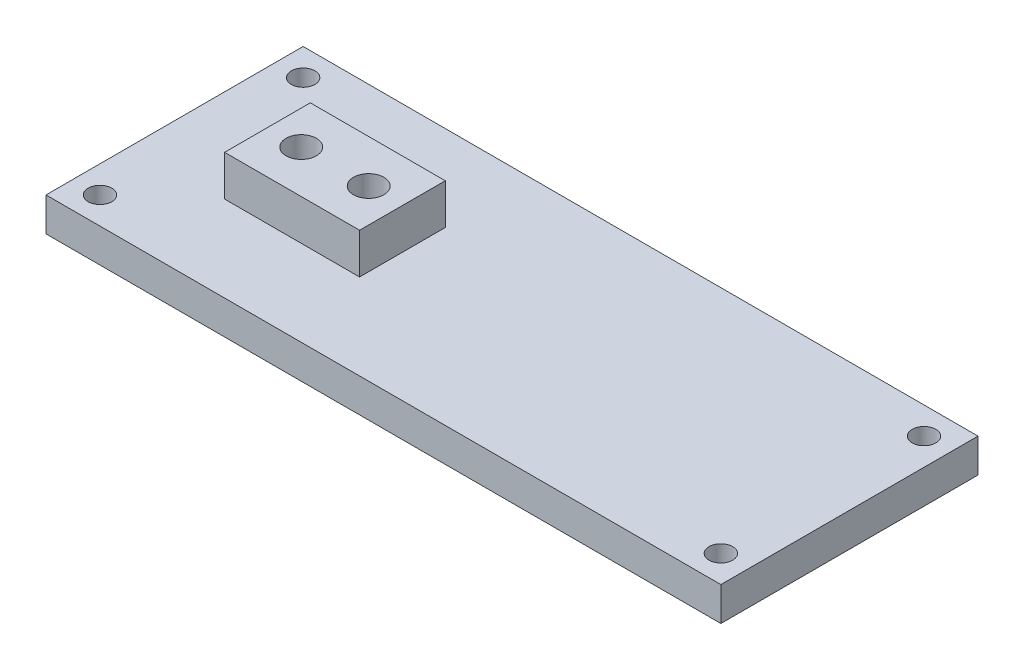
ISO-10303-21;
HEADER;
FILE_DESCRIPTION(('STEP AP214'),'2;1');
FILE_NAME('part.step','',(''),(''),'','','');
FILE_SCHEMA(('AUTOMOTIVE_DESIGN { 1 0 10303 214 1 1 1 1 }'));
ENDSEC;
DATA;
#1=APPLICATION_CONTEXT('core data for automotive mechanical design processes');
#2=APPLICATION_PROTOCOL_DEFINITION('international standard','automotive_design',2000,#1);
#3=PRODUCT_CONTEXT('',#1,'mechanical');
#4=PRODUCT('Part','Part','',(#3));
#5=PRODUCT_RELATED_PRODUCT_CATEGORY('part','',(#4));
#6=PRODUCT_DEFINITION_FORMATION('','',#4);
#7=PRODUCT_DEFINITION_CONTEXT('part definition',#1,'design');
#8=PRODUCT_DEFINITION('design','',#6,#7);
#9=PRODUCT_DEFINITION_SHAPE('','',#8);
#10=(LENGTH_UNIT() NAMED_UNIT(*) SI_UNIT(.MILLI.,.METRE.));
#11=(NAMED_UNIT(*) PLANE_ANGLE_UNIT() SI_UNIT($,.RADIAN.));
#12=(NAMED_UNIT(*) SI_UNIT($,.STERADIAN.) SOLID_ANGLE_UNIT());
#13=UNCERTAINTY_MEASURE_WITH_UNIT(LENGTH_MEASURE(1.E-05),#10,'distance_accuracy_value','');
#14=(GEOMETRIC_REPRESENTATION_CONTEXT(3) GLOBAL_UNCERTAINTY_ASSIGNED_CONTEXT((#13)) GLOBAL_UNIT_ASSIGNED_CONTEXT((#10,
#11,#12)) REPRESENTATION_CONTEXT('',''));
#15=CARTESIAN_POINT('',(0.,0.,0.));
#16=DIRECTION('',(0.,0.,1.));
#17=DIRECTION('',(1.,0.,0.));
#18=AXIS2_PLACEMENT_3D('',#15,#16,#17);
#19=CARTESIAN_POINT('',(-31.2366457438927,0.,0.));
#20=DIRECTION('',(0.,1.,0.));
#21=DIRECTION('',(0.,0.,1.));
#22=AXIS2_PLACEMENT_3D('',#19,#20,#21);
#23=CYLINDRICAL_SURFACE('',#22,2.25);
#24=CARTESIAN_POINT('',(-31.2366457438927,11.,0.));
#25=DIRECTION('',(0.,1.,0.));
#26=DIRECTION('',(0.,0.,1.));
#27=AXIS2_PLACEMENT_3D('',#24,#25,#26);
#28=CIRCLE('',#27,2.25);
#29=CARTESIAN_POINT('',(-31.2366457438927,11.,2.25));
#30=VERTEX_POINT('',#29);
#31=EDGE_CURVE('E195',#30,#30,#28,.T.);
#32=ORIENTED_EDGE('',*,*,#31,.T.);
#33=EDGE_LOOP('',(#32));
#34=FACE_BOUND('',#33,.T.);
#35=CARTESIAN_POINT('',(-31.2366457438927,3.,0.));
#36=DIRECTION('',(0.,-1.,0.));
#37=DIRECTION('',(0.,0.,-1.));
#38=AXIS2_PLACEMENT_3D('',#35,#36,#37);
#39=CIRCLE('',#38,2.25);
#40=CARTESIAN_POINT('',(-31.2366457438927,3.,-2.25));
#41=VERTEX_POINT('',#40);
#42=EDGE_CURVE('E190',#41,#41,#39,.F.);
#43=ORIENTED_EDGE('',*,*,#42,.F.);
#44=EDGE_LOOP('',(#43));
#45=FACE_BOUND('',#44,.T.);
#46=ADVANCED_FACE('F45',(#34,#45),#23,.F.);
#47=CARTESIAN_POINT('',(-21.2366457438927,0.,0.));
#48=DIRECTION('',(0.,1.,0.));
#49=DIRECTION('',(0.,0.,1.));
#50=AXIS2_PLACEMENT_3D('',#47,#48,#49);
#51=CYLINDRICAL_SURFACE('',#50,2.25);
#52=CARTESIAN_POINT('',(-21.2366457438927,11.,0.));
#53=DIRECTION('',(0.,1.,0.));
#54=DIRECTION('',(0.,0.,1.));
#55=AXIS2_PLACEMENT_3D('',#52,#53,#54);
#56=CIRCLE('',#55,2.25);
#57=CARTESIAN_POINT('',(-21.2366457438927,11.,2.25));
#58=VERTEX_POINT('',#57);
#59=EDGE_CURVE('E226',#58,#58,#56,.T.);
#60=ORIENTED_EDGE('',*,*,#59,.T.);
#61=EDGE_LOOP('',(#60));
#62=FACE_BOUND('',#61,.T.);
#63=CARTESIAN_POINT('',(-21.2366457438927,3.,0.));
#64=DIRECTION('',(0.,-1.,0.));
#65=DIRECTION('',(0.,0.,-1.));
#66=AXIS2_PLACEMENT_3D('',#63,#64,#65);
#67=CIRCLE('',#66,2.25);
#68=CARTESIAN_POINT('',(-21.2366457438927,3.,-2.25));
#69=VERTEX_POINT('',#68);
#70=EDGE_CURVE('E186',#69,#69,#67,.F.);
#71=ORIENTED_EDGE('',*,*,#70,.F.);
#72=EDGE_LOOP('',(#71));
#73=FACE_BOUND('',#72,.T.);
#74=ADVANCED_FACE('F280',(#62,#73),#51,.F.);
#75=CARTESIAN_POINT('',(0.,5.,0.));
#76=DIRECTION('',(0.,1.,0.));
#77=DIRECTION('',(0.,0.,1.));
#78=AXIS2_PLACEMENT_3D('',#75,#76,#77);
#79=PLANE('',#78);
#80=CARTESIAN_POINT('',(46.,5.,-15.05));
#81=DIRECTION('',(0.,1.,0.));
#82=DIRECTION('',(0.,0.,-1.));
#83=AXIS2_PLACEMENT_3D('',#80,#81,#82);
#84=CIRCLE('',#83,1.75);
#85=CARTESIAN_POINT('',(46.,5.,-16.8));
#86=VERTEX_POINT('',#85);
#87=EDGE_CURVE('E262',#86,#86,#84,.T.);
#88=ORIENTED_EDGE('',*,*,#87,.F.);
#89=EDGE_LOOP('',(#88));
#90=FACE_BOUND('',#89,.T.);
#91=CARTESIAN_POINT('',(46.,5.,15.05));
#92=DIRECTION('',(0.,1.,0.));
#93=DIRECTION('',(0.,0.,-1.));
#94=AXIS2_PLACEMENT_3D('',#91,#92,#93);
#95=CIRCLE('',#94,1.75);
#96=CARTESIAN_POINT('',(46.,5.,13.3));
#97=VERTEX_POINT('',#96);
#98=EDGE_CURVE('E266',#97,#97,#95,.T.);
#99=ORIENTED_EDGE('',*,*,#98,.F.);
#100=EDGE_LOOP('',(#99));
#101=FACE_BOUND('',#100,.T.);
#102=CARTESIAN_POINT('',(-46.,5.,15.05));
#103=DIRECTION('',(0.,1.,0.));
#104=DIRECTION('',(0.,0.,1.));
#105=AXIS2_PLACEMENT_3D('',#102,#103,#104);
#106=CIRCLE('',#105,1.75);
#107=CARTESIAN_POINT('',(-46.,5.,16.8));
#108=VERTEX_POINT('',#107);
#109=EDGE_CURVE('E261',#108,#108,#106,.T.);
#110=ORIENTED_EDGE('',*,*,#109,.F.);
#111=EDGE_LOOP('',(#110));
#112=FACE_BOUND('',#111,.T.);
#113=CARTESIAN_POINT('',(-46.,5.,-15.05));
#114=DIRECTION('',(0.,1.,0.));
#115=DIRECTION('',(0.,0.,1.));
#116=AXIS2_PLACEMENT_3D('',#113,#114,#115);
#117=CIRCLE('',#116,1.75);
#118=CARTESIAN_POINT('',(-46.,5.,-13.3));
#119=VERTEX_POINT('',#118);
#120=EDGE_CURVE('E201',#119,#119,#117,.T.);
#121=ORIENTED_EDGE('',*,*,#120,.F.);
#122=EDGE_LOOP('',(#121));
#123=FACE_BOUND('',#122,.T.);
#124=DIRECTION('',(0.,0.,-1.));
#125=VECTOR('',#124,1.);
#126=CARTESIAN_POINT('',(50.,5.,-19.05));
#127=LINE('',#126,#125);
#128=CARTESIAN_POINT('',(50.,5.,19.05));
#129=VERTEX_POINT('',#128);
#130=CARTESIAN_POINT('',(50.,5.,-19.05));
#131=VERTEX_POINT('',#130);
#132=EDGE_CURVE('E160',#129,#131,#127,.T.);
#133=ORIENTED_EDGE('',*,*,#132,.T.);
#134=DIRECTION('',(-1.,0.,0.));
#135=VECTOR('',#134,1.);
#136=CARTESIAN_POINT('',(-50.,5.,-19.05));
#137=LINE('',#136,#135);
#138=CARTESIAN_POINT('',(-50.,5.,-19.05));
#139=VERTEX_POINT('',#138);
#140=EDGE_CURVE('E100',#131,#139,#137,.T.);
#141=ORIENTED_EDGE('',*,*,#140,.T.);
#142=DIRECTION('',(0.,0.,1.));
#143=VECTOR('',#142,1.);
#144=CARTESIAN_POINT('',(-50.,5.,-19.05));
#145=LINE('',#144,#143);
#146=CARTESIAN_POINT('',(-50.,5.,19.05));
#147=VERTEX_POINT('',#146);
#148=EDGE_CURVE('E165',#139,#147,#145,.T.);
#149=ORIENTED_EDGE('',*,*,#148,.T.);
#150=DIRECTION('',(1.,0.,0.));
#151=VECTOR('',#150,1.);
#152=CARTESIAN_POINT('',(-50.,5.,19.05));
#153=LINE('',#152,#151);
#154=EDGE_CURVE('E72',#147,#129,#153,.T.);
#155=ORIENTED_EDGE('',*,*,#154,.T.);
#156=EDGE_LOOP('',(#133,#141,#149,#155));
#157=FACE_BOUND('',#156,.T.);
#158=DIRECTION('',(-1.,0.,0.));
#159=VECTOR('',#158,1.);
#160=CARTESIAN_POINT('',(-36.2366457438927,5.,-6.34999999999999));
#161=LINE('',#160,#159);
#162=CARTESIAN_POINT('',(-16.2366457438927,5.,-6.35));
#163=VERTEX_POINT('',#162);
#164=CARTESIAN_POINT('',(-36.2366457438927,5.,-6.34999999999999));
#165=VERTEX_POINT('',#164);
#166=EDGE_CURVE('E240',#163,#165,#161,.T.);
#167=ORIENTED_EDGE('',*,*,#166,.F.);
#168=DIRECTION('',(0.,0.,-1.));
#169=VECTOR('',#168,1.);
#170=CARTESIAN_POINT('',(-16.2366457438927,5.,-6.35));
#171=LINE('',#170,#169);
#172=CARTESIAN_POINT('',(-16.2366457438927,5.,6.35));
#173=VERTEX_POINT('',#172);
#174=EDGE_CURVE('E147',#173,#163,#171,.T.);
#175=ORIENTED_EDGE('',*,*,#174,.F.);
#176=DIRECTION('',(1.,0.,0.));
#177=VECTOR('',#176,1.);
#178=CARTESIAN_POINT('',(-36.2366457438927,5.,6.35));
#179=LINE('',#178,#177);
#180=CARTESIAN_POINT('',(-36.2366457438927,5.,6.35));
#181=VERTEX_POINT('',#180);
#182=EDGE_CURVE('E143',#181,#173,#179,.T.);
#183=ORIENTED_EDGE('',*,*,#182,.F.);
#184=DIRECTION('',(0.,0.,1.));
#185=VECTOR('',#184,1.);
#186=CARTESIAN_POINT('',(-36.2366457438927,5.,-6.34999999999999));
#187=LINE('',#186,#185);
#188=EDGE_CURVE('E243',#165,#181,#187,.T.);
#189=ORIENTED_EDGE('',*,*,#188,.F.);
#190=EDGE_LOOP('',(#167,#175,#183,#189));
#191=FACE_BOUND('',#190,.T.);
#192=ADVANCED_FACE('F277',(#90,#101,#112,#123,#157,#191),#79,.T.);
#193=CARTESIAN_POINT('',(50.,5.,-19.05));
#194=DIRECTION('',(-1.,0.,0.));
#195=DIRECTION('',(0.,0.,1.));
#196=AXIS2_PLACEMENT_3D('',#193,#194,#195);
#197=PLANE('',#196);
#198=DIRECTION('',(0.,0.,-1.));
#199=VECTOR('',#198,1.);
#200=CARTESIAN_POINT('',(50.,0.,-19.05));
#201=LINE('',#200,#199);
#202=CARTESIAN_POINT('',(50.,0.,19.05));
#203=VERTEX_POINT('',#202);
#204=CARTESIAN_POINT('',(50.,0.,-19.05));
#205=VERTEX_POINT('',#204);
#206=EDGE_CURVE('E150',#203,#205,#201,.T.);
#207=ORIENTED_EDGE('',*,*,#206,.T.);
#208=DIRECTION('',(0.,-1.,0.));
#209=VECTOR('',#208,1.);
#210=CARTESIAN_POINT('',(50.,5.,-19.05));
#211=LINE('',#210,#209);
#212=EDGE_CURVE('E11',#131,#205,#211,.T.);
#213=ORIENTED_EDGE('',*,*,#212,.F.);
#214=ORIENTED_EDGE('',*,*,#132,.F.);
#215=DIRECTION('',(0.,-1.,0.));
#216=VECTOR('',#215,1.);
#217=CARTESIAN_POINT('',(50.,5.,19.05));
#218=LINE('',#217,#216);
#219=EDGE_CURVE('E169',#129,#203,#218,.T.);
#220=ORIENTED_EDGE('',*,*,#219,.T.);
#221=EDGE_LOOP('',(#207,#213,#214,#220));
#222=FACE_BOUND('',#221,.T.);
#223=ADVANCED_FACE('F47',(#222),#197,.F.);
#224=CARTESIAN_POINT('',(-50.,5.,-19.05));
#225=DIRECTION('',(0.,0.,1.));
#226=DIRECTION('',(1.,0.,0.));
#227=AXIS2_PLACEMENT_3D('',#224,#225,#226);
#228=PLANE('',#227);
#229=DIRECTION('',(-1.,0.,0.));
#230=VECTOR('',#229,1.);
#231=CARTESIAN_POINT('',(-50.,0.,-19.05));
#232=LINE('',#231,#230);
#233=CARTESIAN_POINT('',(-50.,0.,-19.05));
#234=VERTEX_POINT('',#233);
#235=EDGE_CURVE('E155',#205,#234,#232,.T.);
#236=ORIENTED_EDGE('',*,*,#235,.T.);
#237=DIRECTION('',(0.,-1.,0.));
#238=VECTOR('',#237,1.);
#239=CARTESIAN_POINT('',(-50.,5.,-19.05));
#240=LINE('',#239,#238);
#241=EDGE_CURVE('E55',#139,#234,#240,.T.);
#242=ORIENTED_EDGE('',*,*,#241,.F.);
#243=ORIENTED_EDGE('',*,*,#140,.F.);
#244=ORIENTED_EDGE('',*,*,#212,.T.);
#245=EDGE_LOOP('',(#236,#242,#243,#244));
#246=FACE_BOUND('',#245,.T.);
#247=ADVANCED_FACE('F449',(#246),#228,.F.);
#248=CARTESIAN_POINT('',(-50.,5.,-19.05));
#249=DIRECTION('',(1.,0.,0.));
#250=DIRECTION('',(0.,0.,-1.));
#251=AXIS2_PLACEMENT_3D('',#248,#249,#250);
#252=PLANE('',#251);
#253=DIRECTION('',(0.,0.,1.));
#254=VECTOR('',#253,1.);
#255=CARTESIAN_POINT('',(-50.,0.,-19.05));
#256=LINE('',#255,#254);
#257=CARTESIAN_POINT('',(-50.,0.,19.05));
#258=VERTEX_POINT('',#257);
#259=EDGE_CURVE('E173',#234,#258,#256,.T.);
#260=ORIENTED_EDGE('',*,*,#259,.T.);
#261=DIRECTION('',(0.,-1.,0.));
#262=VECTOR('',#261,1.);
#263=CARTESIAN_POINT('',(-50.,5.,19.05));
#264=LINE('',#263,#262);
#265=EDGE_CURVE('E180',#147,#258,#264,.T.);
#266=ORIENTED_EDGE('',*,*,#265,.F.);
#267=ORIENTED_EDGE('',*,*,#148,.F.);
#268=ORIENTED_EDGE('',*,*,#241,.T.);
#269=EDGE_LOOP('',(#260,#266,#267,#268));
#270=FACE_BOUND('',#269,.T.);
#271=ADVANCED_FACE('F441',(#270),#252,.F.);
#272=CARTESIAN_POINT('',(-50.,5.,19.05));
#273=DIRECTION('',(0.,0.,-1.));
#274=DIRECTION('',(-1.,0.,0.));
#275=AXIS2_PLACEMENT_3D('',#272,#273,#274);
#276=PLANE('',#275);
#277=DIRECTION('',(1.,0.,0.));
#278=VECTOR('',#277,1.);
#279=CARTESIAN_POINT('',(-50.,0.,19.05));
#280=LINE('',#279,#278);
#281=EDGE_CURVE('E93',#258,#203,#280,.T.);
#282=ORIENTED_EDGE('',*,*,#281,.T.);
#283=ORIENTED_EDGE('',*,*,#219,.F.);
#284=ORIENTED_EDGE('',*,*,#154,.F.);
#285=ORIENTED_EDGE('',*,*,#265,.T.);
#286=EDGE_LOOP('',(#282,#283,#284,#285));
#287=FACE_BOUND('',#286,.T.);
#288=ADVANCED_FACE('F433',(#287),#276,.F.);
#289=CARTESIAN_POINT('',(0.,0.,0.));
#290=DIRECTION('',(0.,1.,0.));
#291=DIRECTION('',(0.,0.,1.));
#292=AXIS2_PLACEMENT_3D('',#289,#290,#291);
#293=PLANE('',#292);
#294=CARTESIAN_POINT('',(46.,0.,-15.05));
#295=DIRECTION('',(0.,1.,0.));
#296=DIRECTION('',(0.,0.,1.));
#297=AXIS2_PLACEMENT_3D('',#294,#295,#296);
#298=CIRCLE('',#297,1.75);
#299=CARTESIAN_POINT('',(46.,0.,-13.3));
#300=VERTEX_POINT('',#299);
#301=EDGE_CURVE('E49',#300,#300,#298,.T.);
#302=ORIENTED_EDGE('',*,*,#301,.T.);
#303=EDGE_LOOP('',(#302));
#304=FACE_BOUND('',#303,.T.);
#305=CARTESIAN_POINT('',(46.,0.,15.05));
#306=DIRECTION('',(0.,1.,0.));
#307=DIRECTION('',(0.,0.,1.));
#308=AXIS2_PLACEMENT_3D('',#305,#306,#307);
#309=CIRCLE('',#308,1.75);
#310=CARTESIAN_POINT('',(46.,0.,16.8));
#311=VERTEX_POINT('',#310);
#312=EDGE_CURVE('E204',#311,#311,#309,.T.);
#313=ORIENTED_EDGE('',*,*,#312,.T.);
#314=EDGE_LOOP('',(#313));
#315=FACE_BOUND('',#314,.T.);
#316=CARTESIAN_POINT('',(-46.,0.,15.05));
#317=DIRECTION('',(0.,1.,0.));
#318=DIRECTION('',(0.,0.,1.));
#319=AXIS2_PLACEMENT_3D('',#316,#317,#318);
#320=CIRCLE('',#319,1.75);
#321=CARTESIAN_POINT('',(-46.,0.,16.8));
#322=VERTEX_POINT('',#321);
#323=EDGE_CURVE('E200',#322,#322,#320,.T.);
#324=ORIENTED_EDGE('',*,*,#323,.T.);
#325=EDGE_LOOP('',(#324));
#326=FACE_BOUND('',#325,.T.);
#327=CARTESIAN_POINT('',(-46.,0.,-15.05));
#328=DIRECTION('',(0.,1.,0.));
#329=DIRECTION('',(0.,0.,1.));
#330=AXIS2_PLACEMENT_3D('',#327,#328,#329);
#331=CIRCLE('',#330,1.75);
#332=CARTESIAN_POINT('',(-46.,0.,-13.3));
#333=VERTEX_POINT('',#332);
#334=EDGE_CURVE('E196',#333,#333,#331,.T.);
#335=ORIENTED_EDGE('',*,*,#334,.T.);
#336=EDGE_LOOP('',(#335));
#337=FACE_BOUND('',#336,.T.);
#338=CARTESIAN_POINT('',(-31.2366457438927,0.,0.));
#339=DIRECTION('',(0.,-1.,0.));
#340=DIRECTION('',(0.,0.,-1.));
#341=AXIS2_PLACEMENT_3D('',#338,#339,#340);
#342=CIRCLE('',#341,4.5);
#343=CARTESIAN_POINT('',(-31.2366457438927,0.,-4.5));
#344=VERTEX_POINT('',#343);
#345=EDGE_CURVE('E222',#344,#344,#342,.T.);
#346=ORIENTED_EDGE('',*,*,#345,.F.);
#347=EDGE_LOOP('',(#346));
#348=FACE_BOUND('',#347,.T.);
#349=CARTESIAN_POINT('',(-21.2366457438927,0.,0.));
#350=DIRECTION('',(0.,-1.,0.));
#351=DIRECTION('',(0.,0.,-1.));
#352=AXIS2_PLACEMENT_3D('',#349,#350,#351);
#353=CIRCLE('',#352,4.5);
#354=CARTESIAN_POINT('',(-21.2366457438927,0.,-4.5));
#355=VERTEX_POINT('',#354);
#356=EDGE_CURVE('E216',#355,#355,#353,.T.);
#357=ORIENTED_EDGE('',*,*,#356,.F.);
#358=EDGE_LOOP('',(#357));
#359=FACE_BOUND('',#358,.T.);
#360=ORIENTED_EDGE('',*,*,#206,.F.);
#361=ORIENTED_EDGE('',*,*,#281,.F.);
#362=ORIENTED_EDGE('',*,*,#259,.F.);
#363=ORIENTED_EDGE('',*,*,#235,.F.);
#364=EDGE_LOOP('',(#360,#361,#362,#363));
#365=FACE_BOUND('',#364,.T.);
#366=ADVANCED_FACE('F420',(#304,#315,#326,#337,#348,#359,#365),#293,.F.);
#367=CARTESIAN_POINT('',(-16.2366457438927,11.,-6.35));
#368=DIRECTION('',(-1.,0.,0.));
#369=DIRECTION('',(0.,0.,1.));
#370=AXIS2_PLACEMENT_3D('',#367,#368,#369);
#371=PLANE('',#370);
#372=ORIENTED_EDGE('',*,*,#174,.T.);
#373=DIRECTION('',(0.,-1.,0.));
#374=VECTOR('',#373,1.);
#375=CARTESIAN_POINT('',(-16.2366457438927,11.,-6.35));
#376=LINE('',#375,#374);
#377=CARTESIAN_POINT('',(-16.2366457438927,11.,-6.35));
#378=VERTEX_POINT('',#377);
#379=EDGE_CURVE('E126',#378,#163,#376,.T.);
#380=ORIENTED_EDGE('',*,*,#379,.F.);
#381=DIRECTION('',(0.,0.,-1.));
#382=VECTOR('',#381,1.);
#383=CARTESIAN_POINT('',(-16.2366457438927,11.,-6.35));
#384=LINE('',#383,#382);
#385=CARTESIAN_POINT('',(-16.2366457438927,11.,6.35));
#386=VERTEX_POINT('',#385);
#387=EDGE_CURVE('E134',#386,#378,#384,.T.);
#388=ORIENTED_EDGE('',*,*,#387,.F.);
#389=DIRECTION('',(0.,-1.,0.));
#390=VECTOR('',#389,1.);
#391=CARTESIAN_POINT('',(-16.2366457438927,11.,6.35));
#392=LINE('',#391,#390);
#393=EDGE_CURVE('E237',#386,#173,#392,.T.);
#394=ORIENTED_EDGE('',*,*,#393,.T.);
#395=EDGE_LOOP('',(#372,#380,#388,#394));
#396=FACE_BOUND('',#395,.T.);
#397=ADVANCED_FACE('F145',(#396),#371,.F.);
#398=CARTESIAN_POINT('',(-36.2366457438927,11.,-6.34999999999999));
#399=DIRECTION('',(0.,0.,1.));
#400=DIRECTION('',(1.,0.,0.));
#401=AXIS2_PLACEMENT_3D('',#398,#399,#400);
#402=PLANE('',#401);
#403=ORIENTED_EDGE('',*,*,#166,.T.);
#404=DIRECTION('',(0.,-1.,0.));
#405=VECTOR('',#404,1.);
#406=CARTESIAN_POINT('',(-36.2366457438927,11.,-6.34999999999999));
#407=LINE('',#406,#405);
#408=CARTESIAN_POINT('',(-36.2366457438927,11.,-6.34999999999999));
#409=VERTEX_POINT('',#408);
#410=EDGE_CURVE('E129',#409,#165,#407,.T.);
#411=ORIENTED_EDGE('',*,*,#410,.F.);
#412=DIRECTION('',(-1.,0.,0.));
#413=VECTOR('',#412,1.);
#414=CARTESIAN_POINT('',(-36.2366457438927,11.,-6.34999999999999));
#415=LINE('',#414,#413);
#416=EDGE_CURVE('E122',#378,#409,#415,.T.);
#417=ORIENTED_EDGE('',*,*,#416,.F.);
#418=ORIENTED_EDGE('',*,*,#379,.T.);
#419=EDGE_LOOP('',(#403,#411,#417,#418));
#420=FACE_BOUND('',#419,.T.);
#421=ADVANCED_FACE('F124',(#420),#402,.F.);
#422=CARTESIAN_POINT('',(-36.2366457438927,11.,-6.34999999999999));
#423=DIRECTION('',(1.,0.,0.));
#424=DIRECTION('',(0.,0.,-1.));
#425=AXIS2_PLACEMENT_3D('',#422,#423,#424);
#426=PLANE('',#425);
#427=ORIENTED_EDGE('',*,*,#188,.T.);
#428=DIRECTION('',(0.,-1.,0.));
#429=VECTOR('',#428,1.);
#430=CARTESIAN_POINT('',(-36.2366457438927,11.,6.35));
#431=LINE('',#430,#429);
#432=CARTESIAN_POINT('',(-36.2366457438927,11.,6.35));
#433=VERTEX_POINT('',#432);
#434=EDGE_CURVE('E63',#433,#181,#431,.T.);
#435=ORIENTED_EDGE('',*,*,#434,.F.);
#436=DIRECTION('',(0.,0.,1.));
#437=VECTOR('',#436,1.);
#438=CARTESIAN_POINT('',(-36.2366457438927,11.,-6.34999999999999));
#439=LINE('',#438,#437);
#440=EDGE_CURVE('E133',#409,#433,#439,.T.);
#441=ORIENTED_EDGE('',*,*,#440,.F.);
#442=ORIENTED_EDGE('',*,*,#410,.T.);
#443=EDGE_LOOP('',(#427,#435,#441,#442));
#444=FACE_BOUND('',#443,.T.);
#445=ADVANCED_FACE('F290',(#444),#426,.F.);
#446=CARTESIAN_POINT('',(-36.2366457438927,11.,6.35));
#447=DIRECTION('',(0.,0.,-1.));
#448=DIRECTION('',(-1.,0.,0.));
#449=AXIS2_PLACEMENT_3D('',#446,#447,#448);
#450=PLANE('',#449);
#451=ORIENTED_EDGE('',*,*,#182,.T.);
#452=ORIENTED_EDGE('',*,*,#393,.F.);
#453=DIRECTION('',(1.,0.,0.));
#454=VECTOR('',#453,1.);
#455=CARTESIAN_POINT('',(-36.2366457438927,11.,6.35));
#456=LINE('',#455,#454);
#457=EDGE_CURVE('E138',#433,#386,#456,.T.);
#458=ORIENTED_EDGE('',*,*,#457,.F.);
#459=ORIENTED_EDGE('',*,*,#434,.T.);
#460=EDGE_LOOP('',(#451,#452,#458,#459));
#461=FACE_BOUND('',#460,.T.);
#462=ADVANCED_FACE('F291',(#461),#450,.F.);
#463=CARTESIAN_POINT('',(0.,11.,0.));
#464=DIRECTION('',(0.,1.,0.));
#465=DIRECTION('',(0.,0.,1.));
#466=AXIS2_PLACEMENT_3D('',#463,#464,#465);
#467=PLANE('',#466);
#468=ORIENTED_EDGE('',*,*,#59,.F.);
#469=EDGE_LOOP('',(#468));
#470=FACE_BOUND('',#469,.T.);
#471=ORIENTED_EDGE('',*,*,#31,.F.);
#472=EDGE_LOOP('',(#471));
#473=FACE_BOUND('',#472,.T.);
#474=ORIENTED_EDGE('',*,*,#387,.T.);
#475=ORIENTED_EDGE('',*,*,#416,.T.);
#476=ORIENTED_EDGE('',*,*,#440,.T.);
#477=ORIENTED_EDGE('',*,*,#457,.T.);
#478=EDGE_LOOP('',(#474,#475,#476,#477));
#479=FACE_BOUND('',#478,.T.);
#480=ADVANCED_FACE('F137',(#470,#473,#479),#467,.T.);
#481=CARTESIAN_POINT('',(-21.2366457438927,3.,0.));
#482=DIRECTION('',(0.,-1.,0.));
#483=DIRECTION('',(0.,0.,-1.));
#484=AXIS2_PLACEMENT_3D('',#481,#482,#483);
#485=PLANE('',#484);
#486=CARTESIAN_POINT('',(-21.2366457438927,3.,0.));
#487=DIRECTION('',(0.,-1.,0.));
#488=DIRECTION('',(0.,0.,-1.));
#489=AXIS2_PLACEMENT_3D('',#486,#487,#488);
#490=CIRCLE('',#489,4.5);
#491=CARTESIAN_POINT('',(-21.2366457438927,3.,-4.5));
#492=VERTEX_POINT('',#491);
#493=EDGE_CURVE('E211',#492,#492,#490,.T.);
#494=ORIENTED_EDGE('',*,*,#493,.T.);
#495=EDGE_LOOP('',(#494));
#496=FACE_BOUND('',#495,.T.);
#497=ORIENTED_EDGE('',*,*,#70,.T.);
#498=EDGE_LOOP('',(#497));
#499=FACE_BOUND('',#498,.T.);
#500=ADVANCED_FACE('F298',(#496,#499),#485,.T.);
#501=CARTESIAN_POINT('',(-21.2366457438927,3.,0.));
#502=DIRECTION('',(0.,-1.,0.));
#503=DIRECTION('',(0.,0.,-1.));
#504=AXIS2_PLACEMENT_3D('',#501,#502,#503);
#505=CYLINDRICAL_SURFACE('',#504,4.5);
#506=ORIENTED_EDGE('',*,*,#493,.F.);
#507=EDGE_LOOP('',(#506));
#508=FACE_BOUND('',#507,.T.);
#509=ORIENTED_EDGE('',*,*,#356,.T.);
#510=EDGE_LOOP('',(#509));
#511=FACE_BOUND('',#510,.T.);
#512=ADVANCED_FACE('F314',(#508,#511),#505,.F.);
#513=CARTESIAN_POINT('',(-31.2366457438927,3.,0.));
#514=DIRECTION('',(0.,-1.,0.));
#515=DIRECTION('',(0.,0.,-1.));
#516=AXIS2_PLACEMENT_3D('',#513,#514,#515);
#517=PLANE('',#516);
#518=CARTESIAN_POINT('',(-31.2366457438927,3.,0.));
#519=DIRECTION('',(0.,-1.,0.));
#520=DIRECTION('',(0.,0.,-1.));
#521=AXIS2_PLACEMENT_3D('',#518,#519,#520);
#522=CIRCLE('',#521,4.5);
#523=CARTESIAN_POINT('',(-31.2366457438927,3.,-4.5));
#524=VERTEX_POINT('',#523);
#525=EDGE_CURVE('E191',#524,#524,#522,.T.);
#526=ORIENTED_EDGE('',*,*,#525,.T.);
#527=EDGE_LOOP('',(#526));
#528=FACE_BOUND('',#527,.T.);
#529=ORIENTED_EDGE('',*,*,#42,.T.);
#530=EDGE_LOOP('',(#529));
#531=FACE_BOUND('',#530,.T.);
#532=ADVANCED_FACE('F317',(#528,#531),#517,.T.);
#533=CARTESIAN_POINT('',(-31.2366457438927,3.,0.));
#534=DIRECTION('',(0.,-1.,0.));
#535=DIRECTION('',(0.,0.,-1.));
#536=AXIS2_PLACEMENT_3D('',#533,#534,#535);
#537=CYLINDRICAL_SURFACE('',#536,4.5);
#538=ORIENTED_EDGE('',*,*,#525,.F.);
#539=EDGE_LOOP('',(#538));
#540=FACE_BOUND('',#539,.T.);
#541=ORIENTED_EDGE('',*,*,#345,.T.);
#542=EDGE_LOOP('',(#541));
#543=FACE_BOUND('',#542,.T.);
#544=ADVANCED_FACE('F319',(#540,#543),#537,.F.);
#545=CARTESIAN_POINT('',(-46.,-5.,-15.05));
#546=DIRECTION('',(0.,1.,0.));
#547=DIRECTION('',(0.,0.,1.));
#548=AXIS2_PLACEMENT_3D('',#545,#546,#547);
#549=CYLINDRICAL_SURFACE('',#548,1.75);
#550=ORIENTED_EDGE('',*,*,#120,.T.);
#551=EDGE_LOOP('',(#550));
#552=FACE_BOUND('',#551,.T.);
#553=ORIENTED_EDGE('',*,*,#334,.F.);
#554=EDGE_LOOP('',(#553));
#555=FACE_BOUND('',#554,.T.);
#556=ADVANCED_FACE('F322',(#552,#555),#549,.F.);
#557=CARTESIAN_POINT('',(-46.,-5.,15.05));
#558=DIRECTION('',(0.,1.,0.));
#559=DIRECTION('',(0.,0.,1.));
#560=AXIS2_PLACEMENT_3D('',#557,#558,#559);
#561=CYLINDRICAL_SURFACE('',#560,1.75);
#562=ORIENTED_EDGE('',*,*,#109,.T.);
#563=EDGE_LOOP('',(#562));
#564=FACE_BOUND('',#563,.T.);
#565=ORIENTED_EDGE('',*,*,#323,.F.);
#566=EDGE_LOOP('',(#565));
#567=FACE_BOUND('',#566,.T.);
#568=ADVANCED_FACE('F274',(#564,#567),#561,.F.);
#569=CARTESIAN_POINT('',(46.,-5.,15.05));
#570=DIRECTION('',(0.,1.,0.));
#571=DIRECTION('',(0.,0.,1.));
#572=AXIS2_PLACEMENT_3D('',#569,#570,#571);
#573=CYLINDRICAL_SURFACE('',#572,1.75);
#574=ORIENTED_EDGE('',*,*,#98,.T.);
#575=EDGE_LOOP('',(#574));
#576=FACE_BOUND('',#575,.T.);
#577=ORIENTED_EDGE('',*,*,#312,.F.);
#578=EDGE_LOOP('',(#577));
#579=FACE_BOUND('',#578,.T.);
#580=ADVANCED_FACE('F333',(#576,#579),#573,.F.);
#581=CARTESIAN_POINT('',(46.,-5.,-15.05));
#582=DIRECTION('',(0.,1.,0.));
#583=DIRECTION('',(0.,0.,1.));
#584=AXIS2_PLACEMENT_3D('',#581,#582,#583);
#585=CYLINDRICAL_SURFACE('',#584,1.75);
#586=ORIENTED_EDGE('',*,*,#87,.T.);
#587=EDGE_LOOP('',(#586));
#588=FACE_BOUND('',#587,.T.);
#589=ORIENTED_EDGE('',*,*,#301,.F.);
#590=EDGE_LOOP('',(#589));
#591=FACE_BOUND('',#590,.T.);
#592=ADVANCED_FACE('F330',(#588,#591),#585,.F.);
#593=CLOSED_SHELL('',(#46,#74,#192,#223,#247,#271,#288,#366,#397,#421,#445,#462,#480,#500,#512,
#532,#544,#556,#568,#580,#592));
#594=MANIFOLD_SOLID_BREP('B2',#593);
#595=ADVANCED_BREP_SHAPE_REPRESENTATION('',(#18,#594),#14);
#596=SHAPE_DEFINITION_REPRESENTATION(#9,#595);
ENDSEC;
END-ISO-10303-21;
